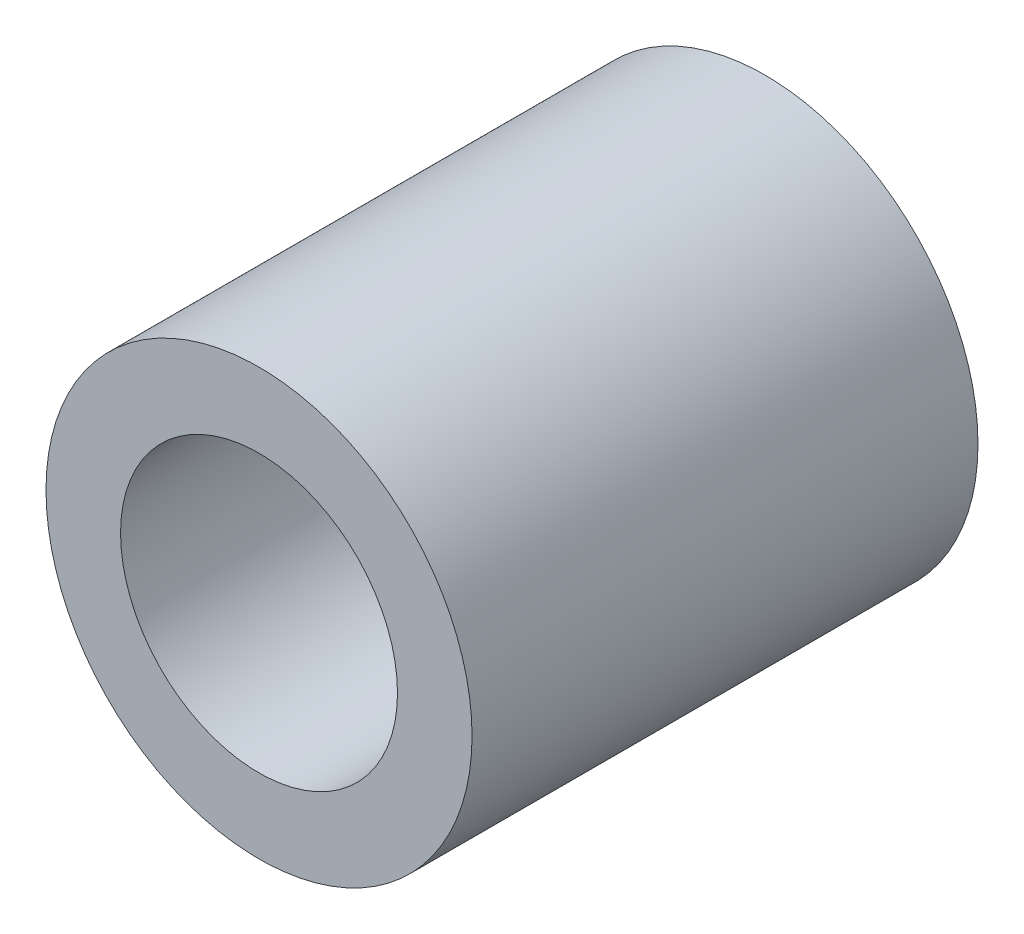
ISO-10303-21;
HEADER;
FILE_DESCRIPTION(('STEP AP214'),'2;1');
FILE_NAME('part.step','',(''),(''),'','','');
FILE_SCHEMA(('AUTOMOTIVE_DESIGN { 1 0 10303 214 1 1 1 1 }'));
ENDSEC;
DATA;
#1=APPLICATION_CONTEXT('core data for automotive mechanical design processes');
#2=APPLICATION_PROTOCOL_DEFINITION('international standard','automotive_design',2000,#1);
#3=PRODUCT_CONTEXT('',#1,'mechanical');
#4=PRODUCT('Part','Part','',(#3));
#5=PRODUCT_RELATED_PRODUCT_CATEGORY('part','',(#4));
#6=PRODUCT_DEFINITION_FORMATION('','',#4);
#7=PRODUCT_DEFINITION_CONTEXT('part definition',#1,'design');
#8=PRODUCT_DEFINITION('design','',#6,#7);
#9=PRODUCT_DEFINITION_SHAPE('','',#8);
#10=(LENGTH_UNIT() NAMED_UNIT(*) SI_UNIT(.MILLI.,.METRE.));
#11=(NAMED_UNIT(*) PLANE_ANGLE_UNIT() SI_UNIT($,.RADIAN.));
#12=(NAMED_UNIT(*) SI_UNIT($,.STERADIAN.) SOLID_ANGLE_UNIT());
#13=UNCERTAINTY_MEASURE_WITH_UNIT(LENGTH_MEASURE(1.E-05),#10,'distance_accuracy_value','');
#14=(GEOMETRIC_REPRESENTATION_CONTEXT(3) GLOBAL_UNCERTAINTY_ASSIGNED_CONTEXT((#13)) GLOBAL_UNIT_ASSIGNED_CONTEXT((#10,
#11,#12)) REPRESENTATION_CONTEXT('',''));
#15=CARTESIAN_POINT('',(0.,0.,0.));
#16=DIRECTION('',(0.,0.,1.));
#17=DIRECTION('',(1.,0.,0.));
#18=AXIS2_PLACEMENT_3D('',#15,#16,#17);
#19=CARTESIAN_POINT('',(0.,0.,9.5));
#20=DIRECTION('',(0.,0.,1.));
#21=DIRECTION('',(1.,0.,0.));
#22=AXIS2_PLACEMENT_3D('',#19,#20,#21);
#23=PLANE('',#22);
#24=CARTESIAN_POINT('',(0.,0.,9.5));
#25=DIRECTION('',(0.,0.,1.));
#26=DIRECTION('',(1.,0.,0.));
#27=AXIS2_PLACEMENT_3D('',#24,#25,#26);
#28=CIRCLE('',#27,4.);
#29=CARTESIAN_POINT('',(4.,0.,9.5));
#30=VERTEX_POINT('',#29);
#31=EDGE_CURVE('E10',#30,#30,#28,.T.);
#32=ORIENTED_EDGE('',*,*,#31,.T.);
#33=EDGE_LOOP('',(#32));
#34=FACE_BOUND('',#33,.T.);
#35=CARTESIAN_POINT('',(0.,0.,9.5));
#36=DIRECTION('',(0.,0.,1.));
#37=DIRECTION('',(1.,0.,0.));
#38=AXIS2_PLACEMENT_3D('',#35,#36,#37);
#39=CIRCLE('',#38,2.6);
#40=CARTESIAN_POINT('',(2.6,0.,9.5));
#41=VERTEX_POINT('',#40);
#42=EDGE_CURVE('E50',#41,#41,#39,.T.);
#43=ORIENTED_EDGE('',*,*,#42,.F.);
#44=EDGE_LOOP('',(#43));
#45=FACE_BOUND('',#44,.T.);
#46=ADVANCED_FACE('F39',(#34,#45),#23,.T.);
#47=CARTESIAN_POINT('',(0.,0.,0.));
#48=DIRECTION('',(0.,0.,1.));
#49=DIRECTION('',(1.,0.,0.));
#50=AXIS2_PLACEMENT_3D('',#47,#48,#49);
#51=PLANE('',#50);
#52=CARTESIAN_POINT('',(0.,0.,0.));
#53=DIRECTION('',(0.,0.,1.));
#54=DIRECTION('',(1.,0.,0.));
#55=AXIS2_PLACEMENT_3D('',#52,#53,#54);
#56=CIRCLE('',#55,4.);
#57=CARTESIAN_POINT('',(4.,0.,0.));
#58=VERTEX_POINT('',#57);
#59=EDGE_CURVE('E43',#58,#58,#56,.T.);
#60=ORIENTED_EDGE('',*,*,#59,.F.);
#61=EDGE_LOOP('',(#60));
#62=FACE_BOUND('',#61,.T.);
#63=CARTESIAN_POINT('',(0.,0.,0.));
#64=DIRECTION('',(0.,0.,1.));
#65=DIRECTION('',(1.,0.,0.));
#66=AXIS2_PLACEMENT_3D('',#63,#64,#65);
#67=CIRCLE('',#66,2.6);
#68=CARTESIAN_POINT('',(2.6,0.,0.));
#69=VERTEX_POINT('',#68);
#70=EDGE_CURVE('E52',#69,#69,#67,.T.);
#71=ORIENTED_EDGE('',*,*,#70,.T.);
#72=EDGE_LOOP('',(#71));
#73=FACE_BOUND('',#72,.T.);
#74=ADVANCED_FACE('F62',(#62,#73),#51,.F.);
#75=CARTESIAN_POINT('',(0.,0.,9.5));
#76=DIRECTION('',(0.,0.,-1.));
#77=DIRECTION('',(-1.,0.,0.));
#78=AXIS2_PLACEMENT_3D('',#75,#76,#77);
#79=CYLINDRICAL_SURFACE('',#78,4.);
#80=ORIENTED_EDGE('',*,*,#31,.F.);
#81=EDGE_LOOP('',(#80));
#82=FACE_BOUND('',#81,.T.);
#83=ORIENTED_EDGE('',*,*,#59,.T.);
#84=EDGE_LOOP('',(#83));
#85=FACE_BOUND('',#84,.T.);
#86=ADVANCED_FACE('F41',(#82,#85),#79,.T.);
#87=CARTESIAN_POINT('',(0.,0.,9.5));
#88=DIRECTION('',(0.,0.,-1.));
#89=DIRECTION('',(-1.,0.,0.));
#90=AXIS2_PLACEMENT_3D('',#87,#88,#89);
#91=CYLINDRICAL_SURFACE('',#90,2.6);
#92=ORIENTED_EDGE('',*,*,#42,.T.);
#93=EDGE_LOOP('',(#92));
#94=FACE_BOUND('',#93,.T.);
#95=ORIENTED_EDGE('',*,*,#70,.F.);
#96=EDGE_LOOP('',(#95));
#97=FACE_BOUND('',#96,.T.);
#98=ADVANCED_FACE('F58',(#94,#97),#91,.F.);
#99=CLOSED_SHELL('',(#46,#74,#86,#98));
#100=MANIFOLD_SOLID_BREP('B2',#99);
#101=ADVANCED_BREP_SHAPE_REPRESENTATION('',(#18,#100),#14);
#102=SHAPE_DEFINITION_REPRESENTATION(#9,#101);
ENDSEC;
END-ISO-10303-21;
